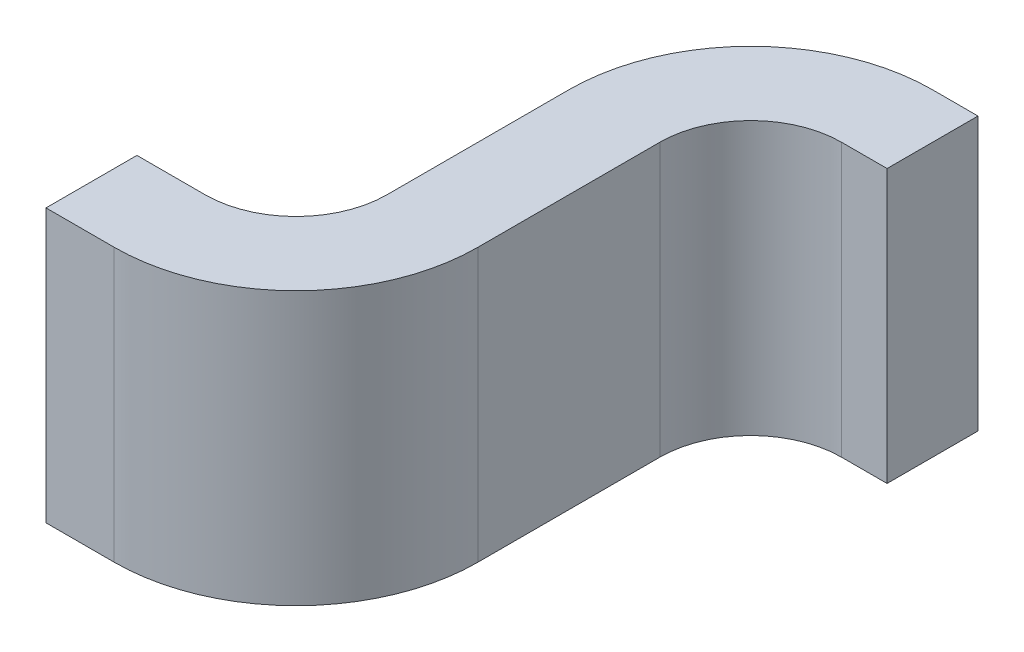
ISO-10303-21;
HEADER;
FILE_DESCRIPTION(('STEP AP214'),'2;1');
FILE_NAME('part.step','',(''),(''),'','','');
FILE_SCHEMA(('AUTOMOTIVE_DESIGN { 1 0 10303 214 1 1 1 1 }'));
ENDSEC;
DATA;
#1=APPLICATION_CONTEXT('core data for automotive mechanical design processes');
#2=APPLICATION_PROTOCOL_DEFINITION('international standard','automotive_design',2000,#1);
#3=PRODUCT_CONTEXT('',#1,'mechanical');
#4=PRODUCT('Part','Part','',(#3));
#5=PRODUCT_RELATED_PRODUCT_CATEGORY('part','',(#4));
#6=PRODUCT_DEFINITION_FORMATION('','',#4);
#7=PRODUCT_DEFINITION_CONTEXT('part definition',#1,'design');
#8=PRODUCT_DEFINITION('design','',#6,#7);
#9=PRODUCT_DEFINITION_SHAPE('','',#8);
#10=(LENGTH_UNIT() NAMED_UNIT(*) SI_UNIT(.MILLI.,.METRE.));
#11=(NAMED_UNIT(*) PLANE_ANGLE_UNIT() SI_UNIT($,.RADIAN.));
#12=(NAMED_UNIT(*) SI_UNIT($,.STERADIAN.) SOLID_ANGLE_UNIT());
#13=UNCERTAINTY_MEASURE_WITH_UNIT(LENGTH_MEASURE(1.E-05),#10,'distance_accuracy_value','');
#14=(GEOMETRIC_REPRESENTATION_CONTEXT(3) GLOBAL_UNCERTAINTY_ASSIGNED_CONTEXT((#13)) GLOBAL_UNIT_ASSIGNED_CONTEXT((#10,
#11,#12)) REPRESENTATION_CONTEXT('',''));
#15=CARTESIAN_POINT('',(0.,0.,0.));
#16=DIRECTION('',(0.,0.,1.));
#17=DIRECTION('',(1.,0.,0.));
#18=AXIS2_PLACEMENT_3D('',#15,#16,#17);
#19=CARTESIAN_POINT('',(0.,0.15,0.6));
#20=DIRECTION('',(0.,0.,-1.));
#21=DIRECTION('',(-1.,0.,0.));
#22=AXIS2_PLACEMENT_3D('',#19,#20,#21);
#23=PLANE('',#22);
#24=DIRECTION('',(1.,0.,0.));
#25=VECTOR('',#24,1.);
#26=CARTESIAN_POINT('',(0.,0.15,0.6));
#27=LINE('',#26,#25);
#28=CARTESIAN_POINT('',(0.075,0.15,0.6));
#29=VERTEX_POINT('',#28);
#30=CARTESIAN_POINT('',(0.,0.15,0.6));
#31=VERTEX_POINT('',#30);
#32=EDGE_CURVE('E192',#29,#31,#27,.F.);
#33=ORIENTED_EDGE('',*,*,#32,.T.);
#34=DIRECTION('',(0.,1.,0.));
#35=VECTOR('',#34,1.);
#36=CARTESIAN_POINT('',(0.,-0.15,0.6));
#37=LINE('',#36,#35);
#38=CARTESIAN_POINT('',(0.,-0.15,0.6));
#39=VERTEX_POINT('',#38);
#40=EDGE_CURVE('E94',#39,#31,#37,.T.);
#41=ORIENTED_EDGE('',*,*,#40,.F.);
#42=DIRECTION('',(1.,0.,0.));
#43=VECTOR('',#42,1.);
#44=CARTESIAN_POINT('',(0.,-0.15,0.6));
#45=LINE('',#44,#43);
#46=CARTESIAN_POINT('',(0.075,-0.15,0.6));
#47=VERTEX_POINT('',#46);
#48=EDGE_CURVE('E175',#39,#47,#45,.T.);
#49=ORIENTED_EDGE('',*,*,#48,.T.);
#50=DIRECTION('',(0.,1.,0.));
#51=VECTOR('',#50,1.);
#52=CARTESIAN_POINT('',(0.075,0.15,0.6));
#53=LINE('',#52,#51);
#54=EDGE_CURVE('E86',#29,#47,#53,.F.);
#55=ORIENTED_EDGE('',*,*,#54,.F.);
#56=EDGE_LOOP('',(#33,#41,#49,#55));
#57=FACE_BOUND('',#56,.T.);
#58=ADVANCED_FACE('F17',(#57),#23,.F.);
#59=CARTESIAN_POINT('',(0.,-0.15,0.5));
#60=DIRECTION('',(-1.,0.,0.));
#61=DIRECTION('',(0.,0.,1.));
#62=AXIS2_PLACEMENT_3D('',#59,#60,#61);
#63=PLANE('',#62);
#64=DIRECTION('',(0.,0.,1.));
#65=VECTOR('',#64,1.);
#66=CARTESIAN_POINT('',(0.,0.15,0.5));
#67=LINE('',#66,#65);
#68=CARTESIAN_POINT('',(0.,0.15,0.5));
#69=VERTEX_POINT('',#68);
#70=EDGE_CURVE('E182',#31,#69,#67,.F.);
#71=ORIENTED_EDGE('',*,*,#70,.T.);
#72=DIRECTION('',(0.,1.,0.));
#73=VECTOR('',#72,1.);
#74=CARTESIAN_POINT('',(0.,-0.15,0.5));
#75=LINE('',#74,#73);
#76=CARTESIAN_POINT('',(0.,-0.15,0.5));
#77=VERTEX_POINT('',#76);
#78=EDGE_CURVE('E165',#69,#77,#75,.F.);
#79=ORIENTED_EDGE('',*,*,#78,.T.);
#80=DIRECTION('',(0.,0.,1.));
#81=VECTOR('',#80,1.);
#82=CARTESIAN_POINT('',(0.,-0.15,0.6));
#83=LINE('',#82,#81);
#84=EDGE_CURVE('E177',#77,#39,#83,.T.);
#85=ORIENTED_EDGE('',*,*,#84,.T.);
#86=ORIENTED_EDGE('',*,*,#40,.T.);
#87=EDGE_LOOP('',(#71,#79,#85,#86));
#88=FACE_BOUND('',#87,.T.);
#89=ADVANCED_FACE('F227',(#88),#63,.T.);
#90=CARTESIAN_POINT('',(0.075,0.15,0.4));
#91=DIRECTION('',(0.,1.,0.));
#92=DIRECTION('',(0.,0.,1.));
#93=AXIS2_PLACEMENT_3D('',#90,#91,#92);
#94=CYLINDRICAL_SURFACE('',#93,0.2);
#95=CARTESIAN_POINT('',(0.075,0.15,0.4));
#96=DIRECTION('',(0.,1.,0.));
#97=DIRECTION('',(0.,0.,1.));
#98=AXIS2_PLACEMENT_3D('',#95,#96,#97);
#99=CIRCLE('',#98,0.2);
#100=CARTESIAN_POINT('',(0.275,0.15,0.4));
#101=VERTEX_POINT('',#100);
#102=EDGE_CURVE('E20',#29,#101,#99,.T.);
#103=ORIENTED_EDGE('',*,*,#102,.F.);
#104=ORIENTED_EDGE('',*,*,#54,.T.);
#105=CARTESIAN_POINT('',(0.075,-0.15,0.4));
#106=DIRECTION('',(0.,1.,0.));
#107=DIRECTION('',(0.,0.,1.));
#108=AXIS2_PLACEMENT_3D('',#105,#106,#107);
#109=CIRCLE('',#108,0.2);
#110=CARTESIAN_POINT('',(0.275,-0.15,0.4));
#111=VERTEX_POINT('',#110);
#112=EDGE_CURVE('E158',#111,#47,#109,.F.);
#113=ORIENTED_EDGE('',*,*,#112,.F.);
#114=DIRECTION('',(0.,1.,0.));
#115=VECTOR('',#114,1.);
#116=CARTESIAN_POINT('',(0.275,0.15,0.4));
#117=LINE('',#116,#115);
#118=EDGE_CURVE('E153',#111,#101,#117,.T.);
#119=ORIENTED_EDGE('',*,*,#118,.T.);
#120=EDGE_LOOP('',(#103,#104,#113,#119));
#121=FACE_BOUND('',#120,.T.);
#122=ADVANCED_FACE('F215',(#121),#94,.T.);
#123=CARTESIAN_POINT('',(0.375,0.15,0.1));
#124=DIRECTION('',(0.,0.,-1.));
#125=DIRECTION('',(-1.,0.,0.));
#126=AXIS2_PLACEMENT_3D('',#123,#124,#125);
#127=PLANE('',#126);
#128=DIRECTION('',(1.,0.,0.));
#129=VECTOR('',#128,1.);
#130=CARTESIAN_POINT('',(0.375,0.15,0.1));
#131=LINE('',#130,#129);
#132=CARTESIAN_POINT('',(0.425,0.15,0.1));
#133=VERTEX_POINT('',#132);
#134=CARTESIAN_POINT('',(0.375,0.15,0.1));
#135=VERTEX_POINT('',#134);
#136=EDGE_CURVE('E151',#133,#135,#131,.F.);
#137=ORIENTED_EDGE('',*,*,#136,.T.);
#138=DIRECTION('',(0.,-1.,0.));
#139=VECTOR('',#138,1.);
#140=CARTESIAN_POINT('',(0.375,0.15,0.1));
#141=LINE('',#140,#139);
#142=CARTESIAN_POINT('',(0.375,-0.15,0.1));
#143=VERTEX_POINT('',#142);
#144=EDGE_CURVE('E150',#135,#143,#141,.T.);
#145=ORIENTED_EDGE('',*,*,#144,.T.);
#146=DIRECTION('',(1.,0.,0.));
#147=VECTOR('',#146,1.);
#148=CARTESIAN_POINT('',(0.375,-0.15,0.1));
#149=LINE('',#148,#147);
#150=CARTESIAN_POINT('',(0.425,-0.15,0.1));
#151=VERTEX_POINT('',#150);
#152=EDGE_CURVE('E121',#143,#151,#149,.T.);
#153=ORIENTED_EDGE('',*,*,#152,.T.);
#154=DIRECTION('',(0.,1.,0.));
#155=VECTOR('',#154,1.);
#156=CARTESIAN_POINT('',(0.425,-0.15,0.1));
#157=LINE('',#156,#155);
#158=EDGE_CURVE('E118',#151,#133,#157,.T.);
#159=ORIENTED_EDGE('',*,*,#158,.T.);
#160=EDGE_LOOP('',(#137,#145,#153,#159));
#161=FACE_BOUND('',#160,.T.);
#162=ADVANCED_FACE('F265',(#161),#127,.F.);
#163=CARTESIAN_POINT('',(0.,-0.15,0.5));
#164=DIRECTION('',(0.,0.,1.));
#165=DIRECTION('',(1.,0.,0.));
#166=AXIS2_PLACEMENT_3D('',#163,#164,#165);
#167=PLANE('',#166);
#168=DIRECTION('',(1.,0.,0.));
#169=VECTOR('',#168,1.);
#170=CARTESIAN_POINT('',(0.,-0.15,0.5));
#171=LINE('',#170,#169);
#172=CARTESIAN_POINT('',(0.075,-0.15,0.5));
#173=VERTEX_POINT('',#172);
#174=EDGE_CURVE('E163',#77,#173,#171,.T.);
#175=ORIENTED_EDGE('',*,*,#174,.F.);
#176=ORIENTED_EDGE('',*,*,#78,.F.);
#177=DIRECTION('',(1.,0.,0.));
#178=VECTOR('',#177,1.);
#179=CARTESIAN_POINT('',(0.,0.15,0.5));
#180=LINE('',#179,#178);
#181=CARTESIAN_POINT('',(0.075,0.15,0.5));
#182=VERTEX_POINT('',#181);
#183=EDGE_CURVE('E168',#182,#69,#180,.F.);
#184=ORIENTED_EDGE('',*,*,#183,.F.);
#185=DIRECTION('',(0.,1.,0.));
#186=VECTOR('',#185,1.);
#187=CARTESIAN_POINT('',(0.075,-0.15,0.5));
#188=LINE('',#187,#186);
#189=EDGE_CURVE('E159',#182,#173,#188,.F.);
#190=ORIENTED_EDGE('',*,*,#189,.T.);
#191=EDGE_LOOP('',(#175,#176,#184,#190));
#192=FACE_BOUND('',#191,.T.);
#193=ADVANCED_FACE('F262',(#192),#167,.F.);
#194=CARTESIAN_POINT('',(0.275,0.15,0.4));
#195=DIRECTION('',(-1.,0.,0.));
#196=DIRECTION('',(0.,0.,1.));
#197=AXIS2_PLACEMENT_3D('',#194,#195,#196);
#198=PLANE('',#197);
#199=DIRECTION('',(0.,0.,-1.));
#200=VECTOR('',#199,1.);
#201=CARTESIAN_POINT('',(0.275,0.15,0.4));
#202=LINE('',#201,#200);
#203=CARTESIAN_POINT('',(0.275,0.15,0.2));
#204=VERTEX_POINT('',#203);
#205=EDGE_CURVE('E146',#204,#101,#202,.F.);
#206=ORIENTED_EDGE('',*,*,#205,.T.);
#207=ORIENTED_EDGE('',*,*,#118,.F.);
#208=DIRECTION('',(0.,0.,1.));
#209=VECTOR('',#208,1.);
#210=CARTESIAN_POINT('',(0.275,-0.15,0.4));
#211=LINE('',#210,#209);
#212=CARTESIAN_POINT('',(0.275,-0.15,0.2));
#213=VERTEX_POINT('',#212);
#214=EDGE_CURVE('E207',#111,#213,#211,.F.);
#215=ORIENTED_EDGE('',*,*,#214,.T.);
#216=DIRECTION('',(0.,-1.,0.));
#217=VECTOR('',#216,1.);
#218=CARTESIAN_POINT('',(0.275,0.15,0.2));
#219=LINE('',#218,#217);
#220=EDGE_CURVE('E120',#213,#204,#219,.F.);
#221=ORIENTED_EDGE('',*,*,#220,.T.);
#222=EDGE_LOOP('',(#206,#207,#215,#221));
#223=FACE_BOUND('',#222,.T.);
#224=ADVANCED_FACE('F217',(#223),#198,.F.);
#225=CARTESIAN_POINT('',(0.425,-0.15,0.));
#226=DIRECTION('',(-1.,0.,0.));
#227=DIRECTION('',(0.,0.,1.));
#228=AXIS2_PLACEMENT_3D('',#225,#226,#227);
#229=PLANE('',#228);
#230=DIRECTION('',(0.,0.,1.));
#231=VECTOR('',#230,1.);
#232=CARTESIAN_POINT('',(0.425,0.15,0.));
#233=LINE('',#232,#231);
#234=CARTESIAN_POINT('',(0.425,0.15,0.));
#235=VERTEX_POINT('',#234);
#236=EDGE_CURVE('E142',#133,#235,#233,.F.);
#237=ORIENTED_EDGE('',*,*,#236,.F.);
#238=ORIENTED_EDGE('',*,*,#158,.F.);
#239=DIRECTION('',(0.,0.,1.));
#240=VECTOR('',#239,1.);
#241=CARTESIAN_POINT('',(0.425,-0.15,0.1));
#242=LINE('',#241,#240);
#243=CARTESIAN_POINT('',(0.425,-0.15,0.));
#244=VERTEX_POINT('',#243);
#245=EDGE_CURVE('E111',#151,#244,#242,.F.);
#246=ORIENTED_EDGE('',*,*,#245,.T.);
#247=DIRECTION('',(0.,1.,0.));
#248=VECTOR('',#247,1.);
#249=CARTESIAN_POINT('',(0.425,-0.15,0.));
#250=LINE('',#249,#248);
#251=EDGE_CURVE('E116',#244,#235,#250,.T.);
#252=ORIENTED_EDGE('',*,*,#251,.T.);
#253=EDGE_LOOP('',(#237,#238,#246,#252));
#254=FACE_BOUND('',#253,.T.);
#255=ADVANCED_FACE('F114',(#254),#229,.F.);
#256=CARTESIAN_POINT('',(0.375,0.15,0.2));
#257=DIRECTION('',(0.,-1.,0.));
#258=DIRECTION('',(0.,0.,-1.));
#259=AXIS2_PLACEMENT_3D('',#256,#257,#258);
#260=CYLINDRICAL_SURFACE('',#259,0.1);
#261=CARTESIAN_POINT('',(0.375,0.15,0.2));
#262=DIRECTION('',(0.,-1.,0.));
#263=DIRECTION('',(0.,0.,-1.));
#264=AXIS2_PLACEMENT_3D('',#261,#262,#263);
#265=CIRCLE('',#264,0.1);
#266=EDGE_CURVE('E204',#204,#135,#265,.T.);
#267=ORIENTED_EDGE('',*,*,#266,.F.);
#268=ORIENTED_EDGE('',*,*,#220,.F.);
#269=CARTESIAN_POINT('',(0.375,-0.15,0.2));
#270=DIRECTION('',(0.,-1.,0.));
#271=DIRECTION('',(0.,0.,-1.));
#272=AXIS2_PLACEMENT_3D('',#269,#270,#271);
#273=CIRCLE('',#272,0.1);
#274=EDGE_CURVE('E133',#143,#213,#273,.F.);
#275=ORIENTED_EDGE('',*,*,#274,.F.);
#276=ORIENTED_EDGE('',*,*,#144,.F.);
#277=EDGE_LOOP('',(#267,#268,#275,#276));
#278=FACE_BOUND('',#277,.T.);
#279=ADVANCED_FACE('F253',(#278),#260,.F.);
#280=CARTESIAN_POINT('',(0.075,-0.15,0.4));
#281=DIRECTION('',(0.,1.,0.));
#282=DIRECTION('',(0.,0.,1.));
#283=AXIS2_PLACEMENT_3D('',#280,#281,#282);
#284=CYLINDRICAL_SURFACE('',#283,0.1);
#285=CARTESIAN_POINT('',(0.075,-0.15,0.4));
#286=DIRECTION('',(0.,1.,0.));
#287=DIRECTION('',(0.,0.,1.));
#288=AXIS2_PLACEMENT_3D('',#285,#286,#287);
#289=CIRCLE('',#288,0.1);
#290=CARTESIAN_POINT('',(0.175,-0.15,0.4));
#291=VERTEX_POINT('',#290);
#292=EDGE_CURVE('E162',#173,#291,#289,.T.);
#293=ORIENTED_EDGE('',*,*,#292,.F.);
#294=ORIENTED_EDGE('',*,*,#189,.F.);
#295=CARTESIAN_POINT('',(0.075,0.15,0.4));
#296=DIRECTION('',(0.,1.,0.));
#297=DIRECTION('',(0.,0.,1.));
#298=AXIS2_PLACEMENT_3D('',#295,#296,#297);
#299=CIRCLE('',#298,0.1);
#300=CARTESIAN_POINT('',(0.175,0.15,0.4));
#301=VERTEX_POINT('',#300);
#302=EDGE_CURVE('E149',#301,#182,#299,.F.);
#303=ORIENTED_EDGE('',*,*,#302,.F.);
#304=DIRECTION('',(0.,1.,0.));
#305=VECTOR('',#304,1.);
#306=CARTESIAN_POINT('',(0.175,-0.15,0.4));
#307=LINE('',#306,#305);
#308=EDGE_CURVE('E368',#301,#291,#307,.F.);
#309=ORIENTED_EDGE('',*,*,#308,.T.);
#310=EDGE_LOOP('',(#293,#294,#303,#309));
#311=FACE_BOUND('',#310,.T.);
#312=ADVANCED_FACE('F250',(#311),#284,.F.);
#313=CARTESIAN_POINT('',(0.268933982822,0.15,0.09393398282202));
#314=DIRECTION('',(0.,1.,0.));
#315=DIRECTION('',(0.,0.,1.));
#316=AXIS2_PLACEMENT_3D('',#313,#314,#315);
#317=PLANE('',#316);
#318=CARTESIAN_POINT('',(0.375,0.15,0.2));
#319=DIRECTION('',(0.,-1.,0.));
#320=DIRECTION('',(0.,0.,-1.));
#321=AXIS2_PLACEMENT_3D('',#318,#319,#320);
#322=CIRCLE('',#321,0.2);
#323=CARTESIAN_POINT('',(0.175,0.15,0.2));
#324=VERTEX_POINT('',#323);
#325=CARTESIAN_POINT('',(0.375,0.15,0.));
#326=VERTEX_POINT('',#325);
#327=EDGE_CURVE('E201',#324,#326,#322,.T.);
#328=ORIENTED_EDGE('',*,*,#327,.F.);
#329=DIRECTION('',(0.,0.,-1.));
#330=VECTOR('',#329,1.);
#331=CARTESIAN_POINT('',(0.175,0.15,0.4));
#332=LINE('',#331,#330);
#333=EDGE_CURVE('E135',#324,#301,#332,.F.);
#334=ORIENTED_EDGE('',*,*,#333,.T.);
#335=ORIENTED_EDGE('',*,*,#302,.T.);
#336=ORIENTED_EDGE('',*,*,#183,.T.);
#337=ORIENTED_EDGE('',*,*,#70,.F.);
#338=ORIENTED_EDGE('',*,*,#32,.F.);
#339=ORIENTED_EDGE('',*,*,#102,.T.);
#340=ORIENTED_EDGE('',*,*,#205,.F.);
#341=ORIENTED_EDGE('',*,*,#266,.T.);
#342=ORIENTED_EDGE('',*,*,#136,.F.);
#343=ORIENTED_EDGE('',*,*,#236,.T.);
#344=DIRECTION('',(1.,0.,0.));
#345=VECTOR('',#344,1.);
#346=CARTESIAN_POINT('',(0.375,0.15,0.));
#347=LINE('',#346,#345);
#348=EDGE_CURVE('E130',#235,#326,#347,.F.);
#349=ORIENTED_EDGE('',*,*,#348,.T.);
#350=EDGE_LOOP('',(#328,#334,#335,#336,#337,#338,#339,#340,#341,#342,#343,#349));
#351=FACE_BOUND('',#350,.T.);
#352=ADVANCED_FACE('F224',(#351),#317,.T.);
#353=CARTESIAN_POINT('',(0.375,-0.15,0.));
#354=DIRECTION('',(0.,0.,1.));
#355=DIRECTION('',(1.,0.,0.));
#356=AXIS2_PLACEMENT_3D('',#353,#354,#355);
#357=PLANE('',#356);
#358=DIRECTION('',(1.,0.,0.));
#359=VECTOR('',#358,1.);
#360=CARTESIAN_POINT('',(0.375,-0.15,0.));
#361=LINE('',#360,#359);
#362=CARTESIAN_POINT('',(0.375,-0.15,0.));
#363=VERTEX_POINT('',#362);
#364=EDGE_CURVE('E123',#363,#244,#361,.T.);
#365=ORIENTED_EDGE('',*,*,#364,.F.);
#366=DIRECTION('',(0.,-1.,0.));
#367=VECTOR('',#366,1.);
#368=CARTESIAN_POINT('',(0.375,-0.15,0.));
#369=LINE('',#368,#367);
#370=EDGE_CURVE('E200',#326,#363,#369,.T.);
#371=ORIENTED_EDGE('',*,*,#370,.F.);
#372=ORIENTED_EDGE('',*,*,#348,.F.);
#373=ORIENTED_EDGE('',*,*,#251,.F.);
#374=EDGE_LOOP('',(#365,#371,#372,#373));
#375=FACE_BOUND('',#374,.T.);
#376=ADVANCED_FACE('F132',(#375),#357,.F.);
#377=CARTESIAN_POINT('',(0.268933982822,-0.15,0.09393398282202));
#378=DIRECTION('',(0.,-1.,0.));
#379=DIRECTION('',(0.,0.,-1.));
#380=AXIS2_PLACEMENT_3D('',#377,#378,#379);
#381=PLANE('',#380);
#382=ORIENTED_EDGE('',*,*,#274,.T.);
#383=ORIENTED_EDGE('',*,*,#214,.F.);
#384=ORIENTED_EDGE('',*,*,#112,.T.);
#385=ORIENTED_EDGE('',*,*,#48,.F.);
#386=ORIENTED_EDGE('',*,*,#84,.F.);
#387=ORIENTED_EDGE('',*,*,#174,.T.);
#388=ORIENTED_EDGE('',*,*,#292,.T.);
#389=DIRECTION('',(0.,0.,-1.));
#390=VECTOR('',#389,1.);
#391=CARTESIAN_POINT('',(0.175,-0.15,0.4));
#392=LINE('',#391,#390);
#393=CARTESIAN_POINT('',(0.175,-0.15,0.2));
#394=VERTEX_POINT('',#393);
#395=EDGE_CURVE('E35',#291,#394,#392,.T.);
#396=ORIENTED_EDGE('',*,*,#395,.T.);
#397=CARTESIAN_POINT('',(0.375,-0.15,0.2));
#398=DIRECTION('',(0.,-1.,0.));
#399=DIRECTION('',(0.,0.,-1.));
#400=AXIS2_PLACEMENT_3D('',#397,#398,#399);
#401=CIRCLE('',#400,0.2);
#402=EDGE_CURVE('E26',#363,#394,#401,.F.);
#403=ORIENTED_EDGE('',*,*,#402,.F.);
#404=ORIENTED_EDGE('',*,*,#364,.T.);
#405=ORIENTED_EDGE('',*,*,#245,.F.);
#406=ORIENTED_EDGE('',*,*,#152,.F.);
#407=EDGE_LOOP('',(#382,#383,#384,#385,#386,#387,#388,#396,#403,#404,#405,#406));
#408=FACE_BOUND('',#407,.T.);
#409=ADVANCED_FACE('F125',(#408),#381,.T.);
#410=CARTESIAN_POINT('',(0.175,-0.15,0.4));
#411=DIRECTION('',(1.,0.,0.));
#412=DIRECTION('',(0.,0.,-1.));
#413=AXIS2_PLACEMENT_3D('',#410,#411,#412);
#414=PLANE('',#413);
#415=ORIENTED_EDGE('',*,*,#395,.F.);
#416=ORIENTED_EDGE('',*,*,#308,.F.);
#417=ORIENTED_EDGE('',*,*,#333,.F.);
#418=DIRECTION('',(0.,-1.,0.));
#419=VECTOR('',#418,1.);
#420=CARTESIAN_POINT('',(0.175,-0.15,0.2));
#421=LINE('',#420,#419);
#422=EDGE_CURVE('E11',#394,#324,#421,.F.);
#423=ORIENTED_EDGE('',*,*,#422,.F.);
#424=EDGE_LOOP('',(#415,#416,#417,#423));
#425=FACE_BOUND('',#424,.T.);
#426=ADVANCED_FACE('F235',(#425),#414,.F.);
#427=CARTESIAN_POINT('',(0.375,-0.15,0.2));
#428=DIRECTION('',(0.,-1.,0.));
#429=DIRECTION('',(0.,0.,-1.));
#430=AXIS2_PLACEMENT_3D('',#427,#428,#429);
#431=CYLINDRICAL_SURFACE('',#430,0.2);
#432=ORIENTED_EDGE('',*,*,#402,.T.);
#433=ORIENTED_EDGE('',*,*,#422,.T.);
#434=ORIENTED_EDGE('',*,*,#327,.T.);
#435=ORIENTED_EDGE('',*,*,#370,.T.);
#436=EDGE_LOOP('',(#432,#433,#434,#435));
#437=FACE_BOUND('',#436,.T.);
#438=ADVANCED_FACE('F233',(#437),#431,.T.);
#439=CLOSED_SHELL('',(#58,#89,#122,#162,#193,#224,#255,#279,#312,#352,#376,#409,#426,#438));
#440=MANIFOLD_SOLID_BREP('B1',#439);
#441=ADVANCED_BREP_SHAPE_REPRESENTATION('',(#18,#440),#14);
#442=SHAPE_DEFINITION_REPRESENTATION(#9,#441);
ENDSEC;
END-ISO-10303-21;
